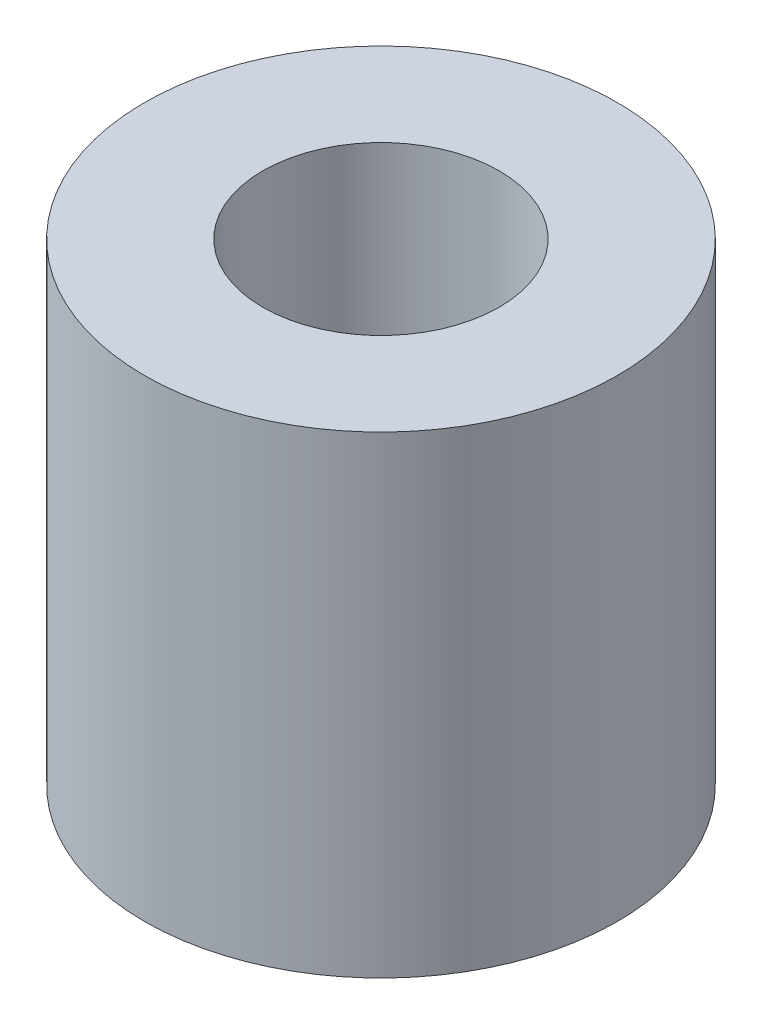
ISO-10303-21;
HEADER;
FILE_DESCRIPTION(('STEP AP214'),'2;1');
FILE_NAME('part.step','',(''),(''),'','','');
FILE_SCHEMA(('AUTOMOTIVE_DESIGN { 1 0 10303 214 1 1 1 1 }'));
ENDSEC;
DATA;
#1=APPLICATION_CONTEXT('core data for automotive mechanical design processes');
#2=APPLICATION_PROTOCOL_DEFINITION('international standard','automotive_design',2000,#1);
#3=PRODUCT_CONTEXT('',#1,'mechanical');
#4=PRODUCT('Part','Part','',(#3));
#5=PRODUCT_RELATED_PRODUCT_CATEGORY('part','',(#4));
#6=PRODUCT_DEFINITION_FORMATION('','',#4);
#7=PRODUCT_DEFINITION_CONTEXT('part definition',#1,'design');
#8=PRODUCT_DEFINITION('design','',#6,#7);
#9=PRODUCT_DEFINITION_SHAPE('','',#8);
#10=(LENGTH_UNIT() NAMED_UNIT(*) SI_UNIT(.MILLI.,.METRE.));
#11=(NAMED_UNIT(*) PLANE_ANGLE_UNIT() SI_UNIT($,.RADIAN.));
#12=(NAMED_UNIT(*) SI_UNIT($,.STERADIAN.) SOLID_ANGLE_UNIT());
#13=UNCERTAINTY_MEASURE_WITH_UNIT(LENGTH_MEASURE(1.E-05),#10,'distance_accuracy_value','');
#14=(GEOMETRIC_REPRESENTATION_CONTEXT(3) GLOBAL_UNCERTAINTY_ASSIGNED_CONTEXT((#13)) GLOBAL_UNIT_ASSIGNED_CONTEXT((#10,
#11,#12)) REPRESENTATION_CONTEXT('',''));
#15=CARTESIAN_POINT('',(0.,0.,0.));
#16=DIRECTION('',(0.,0.,1.));
#17=DIRECTION('',(1.,0.,0.));
#18=AXIS2_PLACEMENT_3D('',#15,#16,#17);
#19=CARTESIAN_POINT('',(0.,7.,0.));
#20=DIRECTION('',(0.,1.,0.));
#21=DIRECTION('',(0.,0.,1.));
#22=AXIS2_PLACEMENT_3D('',#19,#20,#21);
#23=PLANE('',#22);
#24=CARTESIAN_POINT('',(0.,7.,0.));
#25=DIRECTION('',(0.,1.,0.));
#26=DIRECTION('',(0.,0.,1.));
#27=AXIS2_PLACEMENT_3D('',#24,#25,#26);
#28=CIRCLE('',#27,3.5);
#29=CARTESIAN_POINT('',(0.,7.,3.5));
#30=VERTEX_POINT('',#29);
#31=EDGE_CURVE('E10',#30,#30,#28,.T.);
#32=ORIENTED_EDGE('',*,*,#31,.T.);
#33=EDGE_LOOP('',(#32));
#34=FACE_BOUND('',#33,.T.);
#35=CARTESIAN_POINT('',(0.,7.,0.));
#36=DIRECTION('',(0.,1.,0.));
#37=DIRECTION('',(0.,0.,1.));
#38=AXIS2_PLACEMENT_3D('',#35,#36,#37);
#39=CIRCLE('',#38,1.75);
#40=CARTESIAN_POINT('',(0.,7.,1.75));
#41=VERTEX_POINT('',#40);
#42=EDGE_CURVE('E44',#41,#41,#39,.T.);
#43=ORIENTED_EDGE('',*,*,#42,.F.);
#44=EDGE_LOOP('',(#43));
#45=FACE_BOUND('',#44,.T.);
#46=ADVANCED_FACE('F33',(#34,#45),#23,.T.);
#47=CARTESIAN_POINT('',(0.,0.,0.));
#48=DIRECTION('',(0.,1.,0.));
#49=DIRECTION('',(0.,0.,1.));
#50=AXIS2_PLACEMENT_3D('',#47,#48,#49);
#51=PLANE('',#50);
#52=CARTESIAN_POINT('',(0.,0.,0.));
#53=DIRECTION('',(0.,1.,0.));
#54=DIRECTION('',(0.,0.,1.));
#55=AXIS2_PLACEMENT_3D('',#52,#53,#54);
#56=CIRCLE('',#55,3.5);
#57=CARTESIAN_POINT('',(0.,0.,3.5));
#58=VERTEX_POINT('',#57);
#59=EDGE_CURVE('E37',#58,#58,#56,.T.);
#60=ORIENTED_EDGE('',*,*,#59,.F.);
#61=EDGE_LOOP('',(#60));
#62=FACE_BOUND('',#61,.T.);
#63=CARTESIAN_POINT('',(0.,0.,0.));
#64=DIRECTION('',(0.,1.,0.));
#65=DIRECTION('',(0.,0.,1.));
#66=AXIS2_PLACEMENT_3D('',#63,#64,#65);
#67=CIRCLE('',#66,1.75);
#68=CARTESIAN_POINT('',(0.,0.,1.75));
#69=VERTEX_POINT('',#68);
#70=EDGE_CURVE('E46',#69,#69,#67,.T.);
#71=ORIENTED_EDGE('',*,*,#70,.T.);
#72=EDGE_LOOP('',(#71));
#73=FACE_BOUND('',#72,.T.);
#74=ADVANCED_FACE('F56',(#62,#73),#51,.F.);
#75=CARTESIAN_POINT('',(0.,7.,0.));
#76=DIRECTION('',(0.,-1.,0.));
#77=DIRECTION('',(0.,0.,-1.));
#78=AXIS2_PLACEMENT_3D('',#75,#76,#77);
#79=CYLINDRICAL_SURFACE('',#78,3.5);
#80=ORIENTED_EDGE('',*,*,#31,.F.);
#81=EDGE_LOOP('',(#80));
#82=FACE_BOUND('',#81,.T.);
#83=ORIENTED_EDGE('',*,*,#59,.T.);
#84=EDGE_LOOP('',(#83));
#85=FACE_BOUND('',#84,.T.);
#86=ADVANCED_FACE('F35',(#82,#85),#79,.T.);
#87=CARTESIAN_POINT('',(0.,7.,0.));
#88=DIRECTION('',(0.,-1.,0.));
#89=DIRECTION('',(0.,0.,-1.));
#90=AXIS2_PLACEMENT_3D('',#87,#88,#89);
#91=CYLINDRICAL_SURFACE('',#90,1.75);
#92=ORIENTED_EDGE('',*,*,#42,.T.);
#93=EDGE_LOOP('',(#92));
#94=FACE_BOUND('',#93,.T.);
#95=ORIENTED_EDGE('',*,*,#70,.F.);
#96=EDGE_LOOP('',(#95));
#97=FACE_BOUND('',#96,.T.);
#98=ADVANCED_FACE('F52',(#94,#97),#91,.F.);
#99=CLOSED_SHELL('',(#46,#74,#86,#98));
#100=MANIFOLD_SOLID_BREP('B2',#99);
#101=ADVANCED_BREP_SHAPE_REPRESENTATION('',(#18,#100),#14);
#102=SHAPE_DEFINITION_REPRESENTATION(#9,#101);
ENDSEC;
END-ISO-10303-21;
